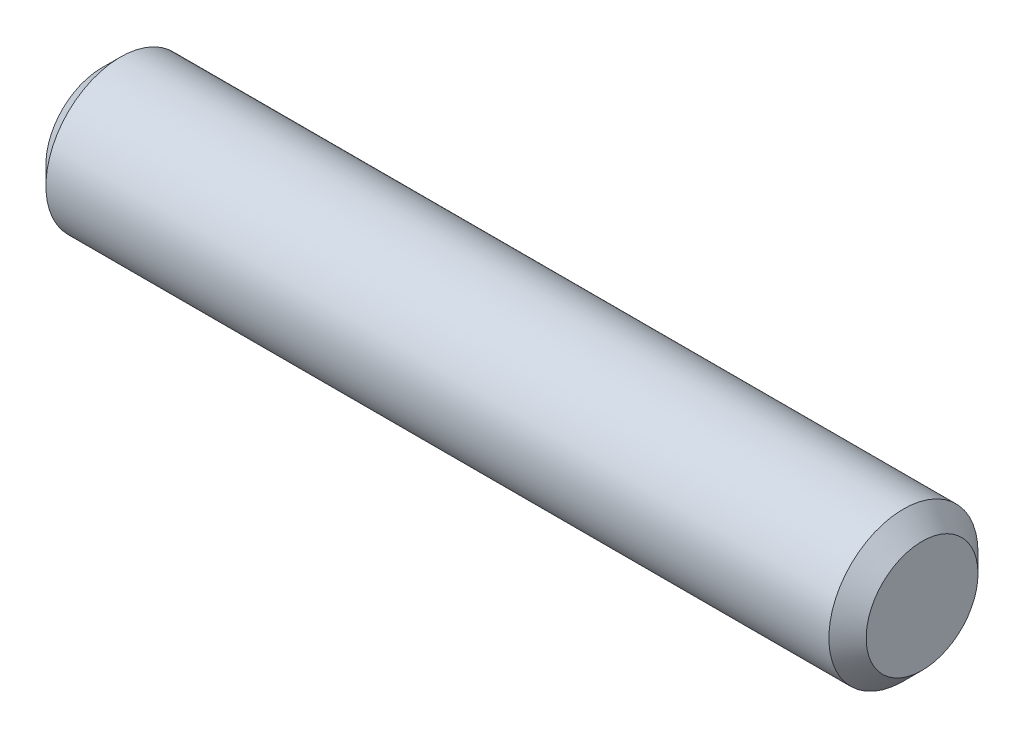
ISO-10303-21;
HEADER;
FILE_DESCRIPTION(('STEP AP214'),'2;1');
FILE_NAME('part.step','',(''),(''),'','','');
FILE_SCHEMA(('AUTOMOTIVE_DESIGN { 1 0 10303 214 1 1 1 1 }'));
ENDSEC;
DATA;
#1=APPLICATION_CONTEXT('core data for automotive mechanical design processes');
#2=APPLICATION_PROTOCOL_DEFINITION('international standard','automotive_design',2000,#1);
#3=PRODUCT_CONTEXT('',#1,'mechanical');
#4=PRODUCT('Part','Part','',(#3));
#5=PRODUCT_RELATED_PRODUCT_CATEGORY('part','',(#4));
#6=PRODUCT_DEFINITION_FORMATION('','',#4);
#7=PRODUCT_DEFINITION_CONTEXT('part definition',#1,'design');
#8=PRODUCT_DEFINITION('design','',#6,#7);
#9=PRODUCT_DEFINITION_SHAPE('','',#8);
#10=(LENGTH_UNIT() NAMED_UNIT(*) SI_UNIT(.MILLI.,.METRE.));
#11=(NAMED_UNIT(*) PLANE_ANGLE_UNIT() SI_UNIT($,.RADIAN.));
#12=(NAMED_UNIT(*) SI_UNIT($,.STERADIAN.) SOLID_ANGLE_UNIT());
#13=UNCERTAINTY_MEASURE_WITH_UNIT(LENGTH_MEASURE(1.E-05),#10,'distance_accuracy_value','');
#14=(GEOMETRIC_REPRESENTATION_CONTEXT(3) GLOBAL_UNCERTAINTY_ASSIGNED_CONTEXT((#13)) GLOBAL_UNIT_ASSIGNED_CONTEXT((#10,
#11,#12)) REPRESENTATION_CONTEXT('',''));
#15=CARTESIAN_POINT('',(0.,0.,0.));
#16=DIRECTION('',(0.,0.,1.));
#17=DIRECTION('',(1.,0.,0.));
#18=AXIS2_PLACEMENT_3D('',#15,#16,#17);
#19=CARTESIAN_POINT('',(11.,0.,0.));
#20=DIRECTION('',(-1.,0.,0.));
#21=DIRECTION('',(0.,0.,1.));
#22=AXIS2_PLACEMENT_3D('',#19,#20,#21);
#23=CYLINDRICAL_SURFACE('',#22,2.);
#24=CARTESIAN_POINT('',(-10.5,0.,0.));
#25=DIRECTION('',(1.,0.,0.));
#26=DIRECTION('',(0.,0.,-1.));
#27=AXIS2_PLACEMENT_3D('',#24,#25,#26);
#28=CIRCLE('',#27,2.);
#29=CARTESIAN_POINT('',(-10.5,0.,-2.));
#30=VERTEX_POINT('',#29);
#31=EDGE_CURVE('E42',#30,#30,#28,.T.);
#32=ORIENTED_EDGE('',*,*,#31,.T.);
#33=EDGE_LOOP('',(#32));
#34=FACE_BOUND('',#33,.T.);
#35=CARTESIAN_POINT('',(10.5,0.,0.));
#36=DIRECTION('',(1.,0.,0.));
#37=DIRECTION('',(0.,0.,-1.));
#38=AXIS2_PLACEMENT_3D('',#35,#36,#37);
#39=CIRCLE('',#38,2.);
#40=CARTESIAN_POINT('',(10.5,0.,-2.));
#41=VERTEX_POINT('',#40);
#42=EDGE_CURVE('E46',#41,#41,#39,.F.);
#43=ORIENTED_EDGE('',*,*,#42,.T.);
#44=EDGE_LOOP('',(#43));
#45=FACE_BOUND('',#44,.T.);
#46=ADVANCED_FACE('F31',(#34,#45),#23,.T.);
#47=CARTESIAN_POINT('',(11.,0.,0.));
#48=DIRECTION('',(1.,0.,0.));
#49=DIRECTION('',(0.,0.,-1.));
#50=AXIS2_PLACEMENT_3D('',#47,#48,#49);
#51=PLANE('',#50);
#52=CARTESIAN_POINT('',(11.,0.,0.));
#53=DIRECTION('',(1.,0.,0.));
#54=DIRECTION('',(0.,0.,-1.));
#55=AXIS2_PLACEMENT_3D('',#52,#53,#54);
#56=CIRCLE('',#55,1.5);
#57=CARTESIAN_POINT('',(11.,0.,-1.5));
#58=VERTEX_POINT('',#57);
#59=EDGE_CURVE('E10',#58,#58,#56,.T.);
#60=ORIENTED_EDGE('',*,*,#59,.T.);
#61=EDGE_LOOP('',(#60));
#62=FACE_BOUND('',#61,.T.);
#63=ADVANCED_FACE('F62',(#62),#51,.T.);
#64=CARTESIAN_POINT('',(-11.,0.,0.));
#65=DIRECTION('',(1.,0.,0.));
#66=DIRECTION('',(0.,0.,-1.));
#67=AXIS2_PLACEMENT_3D('',#64,#65,#66);
#68=PLANE('',#67);
#69=CARTESIAN_POINT('',(-11.,0.,0.));
#70=DIRECTION('',(1.,0.,0.));
#71=DIRECTION('',(0.,0.,-1.));
#72=AXIS2_PLACEMENT_3D('',#69,#70,#71);
#73=CIRCLE('',#72,1.5);
#74=CARTESIAN_POINT('',(-11.,0.,-1.5));
#75=VERTEX_POINT('',#74);
#76=EDGE_CURVE('E38',#75,#75,#73,.F.);
#77=ORIENTED_EDGE('',*,*,#76,.T.);
#78=EDGE_LOOP('',(#77));
#79=FACE_BOUND('',#78,.T.);
#80=ADVANCED_FACE('F59',(#79),#68,.F.);
#81=CARTESIAN_POINT('',(-10.5,0.,0.));
#82=DIRECTION('',(1.,0.,0.));
#83=DIRECTION('',(0.,0.,-1.));
#84=AXIS2_PLACEMENT_3D('',#81,#82,#83);
#85=CONICAL_SURFACE('',#84,2.,0.78539816339745);
#86=ORIENTED_EDGE('',*,*,#76,.F.);
#87=EDGE_LOOP('',(#86));
#88=FACE_BOUND('',#87,.T.);
#89=ORIENTED_EDGE('',*,*,#31,.F.);
#90=EDGE_LOOP('',(#89));
#91=FACE_BOUND('',#90,.T.);
#92=ADVANCED_FACE('F55',(#88,#91),#85,.T.);
#93=CARTESIAN_POINT('',(11.,0.,0.));
#94=DIRECTION('',(-1.,0.,0.));
#95=DIRECTION('',(0.,0.,1.));
#96=AXIS2_PLACEMENT_3D('',#93,#94,#95);
#97=CONICAL_SURFACE('',#96,1.5,0.785398163397445);
#98=ORIENTED_EDGE('',*,*,#42,.F.);
#99=EDGE_LOOP('',(#98));
#100=FACE_BOUND('',#99,.T.);
#101=ORIENTED_EDGE('',*,*,#59,.F.);
#102=EDGE_LOOP('',(#101));
#103=FACE_BOUND('',#102,.T.);
#104=ADVANCED_FACE('F33',(#100,#103),#97,.T.);
#105=CLOSED_SHELL('',(#46,#63,#80,#92,#104));
#106=MANIFOLD_SOLID_BREP('B2',#105);
#107=ADVANCED_BREP_SHAPE_REPRESENTATION('',(#18,#106),#14);
#108=SHAPE_DEFINITION_REPRESENTATION(#9,#107);
ENDSEC;
END-ISO-10303-21;
